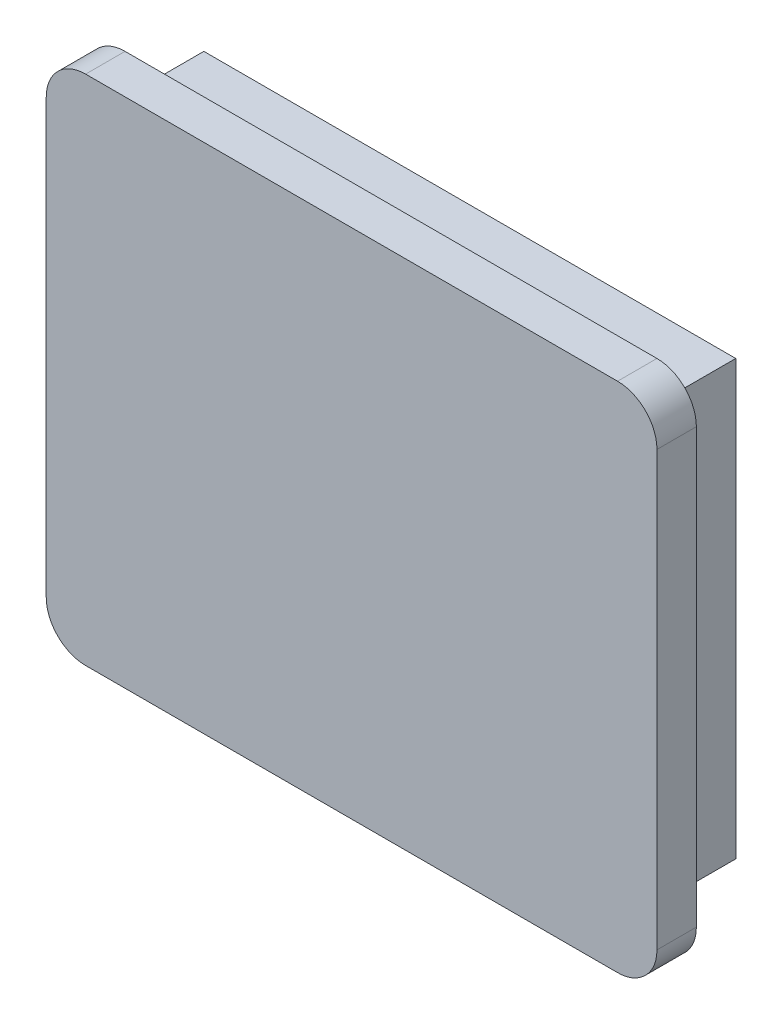
ISO-10303-21;
HEADER;
FILE_DESCRIPTION(('STEP AP214'),'2;1');
FILE_NAME('part.step','',(''),(''),'','','');
FILE_SCHEMA(('AUTOMOTIVE_DESIGN { 1 0 10303 214 1 1 1 1 }'));
ENDSEC;
DATA;
#1=APPLICATION_CONTEXT('core data for automotive mechanical design processes');
#2=APPLICATION_PROTOCOL_DEFINITION('international standard','automotive_design',2000,#1);
#3=PRODUCT_CONTEXT('',#1,'mechanical');
#4=PRODUCT('Part','Part','',(#3));
#5=PRODUCT_RELATED_PRODUCT_CATEGORY('part','',(#4));
#6=PRODUCT_DEFINITION_FORMATION('','',#4);
#7=PRODUCT_DEFINITION_CONTEXT('part definition',#1,'design');
#8=PRODUCT_DEFINITION('design','',#6,#7);
#9=PRODUCT_DEFINITION_SHAPE('','',#8);
#10=(LENGTH_UNIT() NAMED_UNIT(*) SI_UNIT(.MILLI.,.METRE.));
#11=(NAMED_UNIT(*) PLANE_ANGLE_UNIT() SI_UNIT($,.RADIAN.));
#12=(NAMED_UNIT(*) SI_UNIT($,.STERADIAN.) SOLID_ANGLE_UNIT());
#13=UNCERTAINTY_MEASURE_WITH_UNIT(LENGTH_MEASURE(1.E-05),#10,'distance_accuracy_value','');
#14=(GEOMETRIC_REPRESENTATION_CONTEXT(3) GLOBAL_UNCERTAINTY_ASSIGNED_CONTEXT((#13)) GLOBAL_UNIT_ASSIGNED_CONTEXT((#10,
#11,#12)) REPRESENTATION_CONTEXT('',''));
#15=CARTESIAN_POINT('',(0.,0.,0.));
#16=DIRECTION('',(0.,0.,1.));
#17=DIRECTION('',(1.,0.,0.));
#18=AXIS2_PLACEMENT_3D('',#15,#16,#17);
#19=CARTESIAN_POINT('',(0.,0.,0.));
#20=DIRECTION('',(0.,0.,1.));
#21=DIRECTION('',(1.,0.,0.));
#22=AXIS2_PLACEMENT_3D('',#19,#20,#21);
#23=PLANE('',#22);
#24=DIRECTION('',(0.,1.,0.));
#25=VECTOR('',#24,1.);
#26=CARTESIAN_POINT('',(7.75,-6.5,0.));
#27=LINE('',#26,#25);
#28=CARTESIAN_POINT('',(7.75,-5.5,0.));
#29=VERTEX_POINT('',#28);
#30=CARTESIAN_POINT('',(7.75,5.5,0.));
#31=VERTEX_POINT('',#30);
#32=EDGE_CURVE('E194',#29,#31,#27,.T.);
#33=ORIENTED_EDGE('',*,*,#32,.F.);
#34=CARTESIAN_POINT('',(6.75,-5.5,0.));
#35=DIRECTION('',(0.,0.,1.));
#36=DIRECTION('',(1.,0.,0.));
#37=AXIS2_PLACEMENT_3D('',#34,#35,#36);
#38=CIRCLE('',#37,1.);
#39=CARTESIAN_POINT('',(6.75,-6.5,0.));
#40=VERTEX_POINT('',#39);
#41=EDGE_CURVE('E208',#29,#40,#38,.F.);
#42=ORIENTED_EDGE('',*,*,#41,.T.);
#43=DIRECTION('',(1.,0.,0.));
#44=VECTOR('',#43,1.);
#45=CARTESIAN_POINT('',(7.75,-6.5,0.));
#46=LINE('',#45,#44);
#47=CARTESIAN_POINT('',(-6.75,-6.5,0.));
#48=VERTEX_POINT('',#47);
#49=EDGE_CURVE('E174',#48,#40,#46,.T.);
#50=ORIENTED_EDGE('',*,*,#49,.F.);
#51=CARTESIAN_POINT('',(-6.75,-5.5,0.));
#52=DIRECTION('',(0.,0.,1.));
#53=DIRECTION('',(1.,0.,0.));
#54=AXIS2_PLACEMENT_3D('',#51,#52,#53);
#55=CIRCLE('',#54,1.);
#56=CARTESIAN_POINT('',(-7.75,-5.5,0.));
#57=VERTEX_POINT('',#56);
#58=EDGE_CURVE('E206',#48,#57,#55,.F.);
#59=ORIENTED_EDGE('',*,*,#58,.T.);
#60=DIRECTION('',(0.,-1.,0.));
#61=VECTOR('',#60,1.);
#62=CARTESIAN_POINT('',(-7.75,-6.5,0.));
#63=LINE('',#62,#61);
#64=CARTESIAN_POINT('',(-7.75,5.5,0.));
#65=VERTEX_POINT('',#64);
#66=EDGE_CURVE('E171',#65,#57,#63,.T.);
#67=ORIENTED_EDGE('',*,*,#66,.F.);
#68=CARTESIAN_POINT('',(-6.75,5.5,0.));
#69=DIRECTION('',(0.,0.,1.));
#70=DIRECTION('',(1.,0.,0.));
#71=AXIS2_PLACEMENT_3D('',#68,#69,#70);
#72=CIRCLE('',#71,1.);
#73=CARTESIAN_POINT('',(-6.75,6.5,0.));
#74=VERTEX_POINT('',#73);
#75=EDGE_CURVE('E204',#65,#74,#72,.F.);
#76=ORIENTED_EDGE('',*,*,#75,.T.);
#77=DIRECTION('',(-1.,0.,0.));
#78=VECTOR('',#77,1.);
#79=CARTESIAN_POINT('',(7.75,6.5,0.));
#80=LINE('',#79,#78);
#81=CARTESIAN_POINT('',(6.75,6.5,0.));
#82=VERTEX_POINT('',#81);
#83=EDGE_CURVE('E184',#82,#74,#80,.T.);
#84=ORIENTED_EDGE('',*,*,#83,.F.);
#85=CARTESIAN_POINT('',(6.75,5.5,0.));
#86=DIRECTION('',(0.,0.,1.));
#87=DIRECTION('',(1.,0.,0.));
#88=AXIS2_PLACEMENT_3D('',#85,#86,#87);
#89=CIRCLE('',#88,1.);
#90=EDGE_CURVE('E202',#82,#31,#89,.F.);
#91=ORIENTED_EDGE('',*,*,#90,.T.);
#92=EDGE_LOOP('',(#33,#42,#50,#59,#67,#76,#84,#91));
#93=FACE_BOUND('',#92,.T.);
#94=DIRECTION('',(0.,-1.,0.));
#95=VECTOR('',#94,1.);
#96=CARTESIAN_POINT('',(6.75,-5.5,0.));
#97=LINE('',#96,#95);
#98=CARTESIAN_POINT('',(6.75,5.5,0.));
#99=VERTEX_POINT('',#98);
#100=CARTESIAN_POINT('',(6.75,-5.5,0.));
#101=VERTEX_POINT('',#100);
#102=EDGE_CURVE('E170',#99,#101,#97,.T.);
#103=ORIENTED_EDGE('',*,*,#102,.F.);
#104=DIRECTION('',(1.,0.,0.));
#105=VECTOR('',#104,1.);
#106=CARTESIAN_POINT('',(-6.75,5.5,0.));
#107=LINE('',#106,#105);
#108=CARTESIAN_POINT('',(-6.75,5.5,0.));
#109=VERTEX_POINT('',#108);
#110=EDGE_CURVE('E167',#109,#99,#107,.T.);
#111=ORIENTED_EDGE('',*,*,#110,.F.);
#112=DIRECTION('',(0.,1.,0.));
#113=VECTOR('',#112,1.);
#114=CARTESIAN_POINT('',(-6.75,4.5,0.));
#115=LINE('',#114,#113);
#116=CARTESIAN_POINT('',(-6.75,4.5,0.));
#117=VERTEX_POINT('',#116);
#118=EDGE_CURVE('E416',#117,#109,#115,.T.);
#119=ORIENTED_EDGE('',*,*,#118,.F.);
#120=DIRECTION('',(-1.,0.,0.));
#121=VECTOR('',#120,1.);
#122=CARTESIAN_POINT('',(-5.52272727272727,4.5,0.));
#123=LINE('',#122,#121);
#124=CARTESIAN_POINT('',(5.52272727272727,4.5,0.));
#125=VERTEX_POINT('',#124);
#126=EDGE_CURVE('E450',#125,#117,#123,.T.);
#127=ORIENTED_EDGE('',*,*,#126,.F.);
#128=DIRECTION('',(0.,1.,0.));
#129=VECTOR('',#128,1.);
#130=CARTESIAN_POINT('',(5.52272727272727,-4.5,0.));
#131=LINE('',#130,#129);
#132=CARTESIAN_POINT('',(5.52272727272727,-4.5,0.));
#133=VERTEX_POINT('',#132);
#134=EDGE_CURVE('E443',#133,#125,#131,.T.);
#135=ORIENTED_EDGE('',*,*,#134,.F.);
#136=DIRECTION('',(1.,0.,0.));
#137=VECTOR('',#136,1.);
#138=CARTESIAN_POINT('',(-5.52272727272727,-4.5,0.));
#139=LINE('',#138,#137);
#140=CARTESIAN_POINT('',(-6.75,-4.5,0.));
#141=VERTEX_POINT('',#140);
#142=EDGE_CURVE('E437',#141,#133,#139,.T.);
#143=ORIENTED_EDGE('',*,*,#142,.F.);
#144=DIRECTION('',(0.,1.,0.));
#145=VECTOR('',#144,1.);
#146=CARTESIAN_POINT('',(-6.75,-5.5,0.));
#147=LINE('',#146,#145);
#148=CARTESIAN_POINT('',(-6.75,-5.5,0.));
#149=VERTEX_POINT('',#148);
#150=EDGE_CURVE('E440',#149,#141,#147,.T.);
#151=ORIENTED_EDGE('',*,*,#150,.F.);
#152=DIRECTION('',(-1.,0.,0.));
#153=VECTOR('',#152,1.);
#154=CARTESIAN_POINT('',(-6.75,-5.5,0.));
#155=LINE('',#154,#153);
#156=EDGE_CURVE('E441',#101,#149,#155,.T.);
#157=ORIENTED_EDGE('',*,*,#156,.F.);
#158=EDGE_LOOP('',(#103,#111,#119,#127,#135,#143,#151,#157));
#159=FACE_BOUND('',#158,.T.);
#160=ADVANCED_FACE('F33',(#93,#159),#23,.F.);
#161=CARTESIAN_POINT('',(-7.75,-6.5,1.));
#162=DIRECTION('',(1.,0.,0.));
#163=DIRECTION('',(0.,0.,-1.));
#164=AXIS2_PLACEMENT_3D('',#161,#162,#163);
#165=PLANE('',#164);
#166=ORIENTED_EDGE('',*,*,#66,.T.);
#167=DIRECTION('',(0.,0.,-1.));
#168=VECTOR('',#167,1.);
#169=CARTESIAN_POINT('',(-7.75,-5.5,1.));
#170=LINE('',#169,#168);
#171=CARTESIAN_POINT('',(-7.75,-5.5,1.));
#172=VERTEX_POINT('',#171);
#173=EDGE_CURVE('E225',#57,#172,#170,.F.);
#174=ORIENTED_EDGE('',*,*,#173,.T.);
#175=DIRECTION('',(0.,-1.,0.));
#176=VECTOR('',#175,1.);
#177=CARTESIAN_POINT('',(-7.75,-6.5,1.));
#178=LINE('',#177,#176);
#179=CARTESIAN_POINT('',(-7.75,5.5,1.));
#180=VERTEX_POINT('',#179);
#181=EDGE_CURVE('E180',#180,#172,#178,.T.);
#182=ORIENTED_EDGE('',*,*,#181,.F.);
#183=DIRECTION('',(0.,0.,-1.));
#184=VECTOR('',#183,1.);
#185=CARTESIAN_POINT('',(-7.75,5.5,1.));
#186=LINE('',#185,#184);
#187=EDGE_CURVE('E222',#180,#65,#186,.T.);
#188=ORIENTED_EDGE('',*,*,#187,.T.);
#189=EDGE_LOOP('',(#166,#174,#182,#188));
#190=FACE_BOUND('',#189,.T.);
#191=ADVANCED_FACE('F241',(#190),#165,.F.);
#192=CARTESIAN_POINT('',(7.75,-6.5,1.));
#193=DIRECTION('',(0.,1.,0.));
#194=DIRECTION('',(0.,0.,1.));
#195=AXIS2_PLACEMENT_3D('',#192,#193,#194);
#196=PLANE('',#195);
#197=ORIENTED_EDGE('',*,*,#49,.T.);
#198=DIRECTION('',(0.,0.,-1.));
#199=VECTOR('',#198,1.);
#200=CARTESIAN_POINT('',(6.75,-6.5,1.));
#201=LINE('',#200,#199);
#202=CARTESIAN_POINT('',(6.75,-6.5,1.));
#203=VERTEX_POINT('',#202);
#204=EDGE_CURVE('E213',#40,#203,#201,.F.);
#205=ORIENTED_EDGE('',*,*,#204,.T.);
#206=DIRECTION('',(1.,0.,0.));
#207=VECTOR('',#206,1.);
#208=CARTESIAN_POINT('',(7.75,-6.5,1.));
#209=LINE('',#208,#207);
#210=CARTESIAN_POINT('',(-6.75,-6.5,1.));
#211=VERTEX_POINT('',#210);
#212=EDGE_CURVE('E183',#211,#203,#209,.T.);
#213=ORIENTED_EDGE('',*,*,#212,.F.);
#214=DIRECTION('',(0.,0.,-1.));
#215=VECTOR('',#214,1.);
#216=CARTESIAN_POINT('',(-6.75,-6.5,1.));
#217=LINE('',#216,#215);
#218=EDGE_CURVE('E210',#211,#48,#217,.T.);
#219=ORIENTED_EDGE('',*,*,#218,.T.);
#220=EDGE_LOOP('',(#197,#205,#213,#219));
#221=FACE_BOUND('',#220,.T.);
#222=ADVANCED_FACE('F251',(#221),#196,.F.);
#223=CARTESIAN_POINT('',(7.75,-6.5,1.));
#224=DIRECTION('',(-1.,0.,0.));
#225=DIRECTION('',(0.,0.,1.));
#226=AXIS2_PLACEMENT_3D('',#223,#224,#225);
#227=PLANE('',#226);
#228=DIRECTION('',(0.,1.,0.));
#229=VECTOR('',#228,1.);
#230=CARTESIAN_POINT('',(7.75,-6.5,1.));
#231=LINE('',#230,#229);
#232=CARTESIAN_POINT('',(7.75,-5.5,1.));
#233=VERTEX_POINT('',#232);
#234=CARTESIAN_POINT('',(7.75,5.5,1.));
#235=VERTEX_POINT('',#234);
#236=EDGE_CURVE('E187',#233,#235,#231,.T.);
#237=ORIENTED_EDGE('',*,*,#236,.F.);
#238=DIRECTION('',(0.,0.,-1.));
#239=VECTOR('',#238,1.);
#240=CARTESIAN_POINT('',(7.75,-5.5,1.));
#241=LINE('',#240,#239);
#242=EDGE_CURVE('E199',#233,#29,#241,.T.);
#243=ORIENTED_EDGE('',*,*,#242,.T.);
#244=ORIENTED_EDGE('',*,*,#32,.T.);
#245=DIRECTION('',(0.,0.,-1.));
#246=VECTOR('',#245,1.);
#247=CARTESIAN_POINT('',(7.75,5.5,1.));
#248=LINE('',#247,#246);
#249=EDGE_CURVE('E190',#31,#235,#248,.F.);
#250=ORIENTED_EDGE('',*,*,#249,.T.);
#251=EDGE_LOOP('',(#237,#243,#244,#250));
#252=FACE_BOUND('',#251,.T.);
#253=ADVANCED_FACE('F259',(#252),#227,.F.);
#254=CARTESIAN_POINT('',(7.75,6.5,1.));
#255=DIRECTION('',(0.,-1.,0.));
#256=DIRECTION('',(0.,0.,-1.));
#257=AXIS2_PLACEMENT_3D('',#254,#255,#256);
#258=PLANE('',#257);
#259=ORIENTED_EDGE('',*,*,#83,.T.);
#260=DIRECTION('',(0.,0.,-1.));
#261=VECTOR('',#260,1.);
#262=CARTESIAN_POINT('',(-6.75,6.5,1.));
#263=LINE('',#262,#261);
#264=CARTESIAN_POINT('',(-6.75,6.5,1.));
#265=VERTEX_POINT('',#264);
#266=EDGE_CURVE('E11',#74,#265,#263,.F.);
#267=ORIENTED_EDGE('',*,*,#266,.T.);
#268=DIRECTION('',(-1.,0.,0.));
#269=VECTOR('',#268,1.);
#270=CARTESIAN_POINT('',(7.75,6.5,1.));
#271=LINE('',#270,#269);
#272=CARTESIAN_POINT('',(6.75,6.5,1.));
#273=VERTEX_POINT('',#272);
#274=EDGE_CURVE('E189',#273,#265,#271,.T.);
#275=ORIENTED_EDGE('',*,*,#274,.F.);
#276=DIRECTION('',(0.,0.,-1.));
#277=VECTOR('',#276,1.);
#278=CARTESIAN_POINT('',(6.75,6.5,1.));
#279=LINE('',#278,#277);
#280=EDGE_CURVE('E41',#273,#82,#279,.T.);
#281=ORIENTED_EDGE('',*,*,#280,.T.);
#282=EDGE_LOOP('',(#259,#267,#275,#281));
#283=FACE_BOUND('',#282,.T.);
#284=ADVANCED_FACE('F229',(#283),#258,.F.);
#285=CARTESIAN_POINT('',(0.,0.,1.));
#286=DIRECTION('',(0.,0.,1.));
#287=DIRECTION('',(1.,0.,0.));
#288=AXIS2_PLACEMENT_3D('',#285,#286,#287);
#289=PLANE('',#288);
#290=ORIENTED_EDGE('',*,*,#212,.T.);
#291=CARTESIAN_POINT('',(6.75,-5.5,1.));
#292=DIRECTION('',(0.,0.,1.));
#293=DIRECTION('',(1.,0.,0.));
#294=AXIS2_PLACEMENT_3D('',#291,#292,#293);
#295=CIRCLE('',#294,1.);
#296=EDGE_CURVE('E220',#203,#233,#295,.T.);
#297=ORIENTED_EDGE('',*,*,#296,.T.);
#298=ORIENTED_EDGE('',*,*,#236,.T.);
#299=CARTESIAN_POINT('',(6.75,5.5,1.));
#300=DIRECTION('',(0.,0.,1.));
#301=DIRECTION('',(1.,0.,0.));
#302=AXIS2_PLACEMENT_3D('',#299,#300,#301);
#303=CIRCLE('',#302,1.);
#304=EDGE_CURVE('E53',#235,#273,#303,.T.);
#305=ORIENTED_EDGE('',*,*,#304,.T.);
#306=ORIENTED_EDGE('',*,*,#274,.T.);
#307=CARTESIAN_POINT('',(-6.75,5.5,1.));
#308=DIRECTION('',(0.,0.,1.));
#309=DIRECTION('',(1.,0.,0.));
#310=AXIS2_PLACEMENT_3D('',#307,#308,#309);
#311=CIRCLE('',#310,1.);
#312=EDGE_CURVE('E216',#265,#180,#311,.T.);
#313=ORIENTED_EDGE('',*,*,#312,.T.);
#314=ORIENTED_EDGE('',*,*,#181,.T.);
#315=CARTESIAN_POINT('',(-6.75,-5.5,1.));
#316=DIRECTION('',(0.,0.,1.));
#317=DIRECTION('',(1.,0.,0.));
#318=AXIS2_PLACEMENT_3D('',#315,#316,#317);
#319=CIRCLE('',#318,1.);
#320=EDGE_CURVE('E218',#172,#211,#319,.T.);
#321=ORIENTED_EDGE('',*,*,#320,.T.);
#322=EDGE_LOOP('',(#290,#297,#298,#305,#306,#313,#314,#321));
#323=FACE_BOUND('',#322,.T.);
#324=ADVANCED_FACE('F244',(#323),#289,.T.);
#325=CARTESIAN_POINT('',(6.75,-5.5,-2.));
#326=DIRECTION('',(-1.,0.,0.));
#327=DIRECTION('',(0.,0.,1.));
#328=AXIS2_PLACEMENT_3D('',#325,#326,#327);
#329=PLANE('',#328);
#330=ORIENTED_EDGE('',*,*,#102,.T.);
#331=DIRECTION('',(0.,0.,1.));
#332=VECTOR('',#331,1.);
#333=CARTESIAN_POINT('',(6.75,-5.5,-2.));
#334=LINE('',#333,#332);
#335=CARTESIAN_POINT('',(6.75,-5.5,-2.));
#336=VERTEX_POINT('',#335);
#337=EDGE_CURVE('E151',#336,#101,#334,.T.);
#338=ORIENTED_EDGE('',*,*,#337,.F.);
#339=DIRECTION('',(0.,-1.,0.));
#340=VECTOR('',#339,1.);
#341=CARTESIAN_POINT('',(6.75,-5.5,-2.));
#342=LINE('',#341,#340);
#343=CARTESIAN_POINT('',(6.75,5.5,-2.));
#344=VERTEX_POINT('',#343);
#345=EDGE_CURVE('E158',#344,#336,#342,.T.);
#346=ORIENTED_EDGE('',*,*,#345,.F.);
#347=DIRECTION('',(0.,0.,1.));
#348=VECTOR('',#347,1.);
#349=CARTESIAN_POINT('',(6.75,5.5,-2.));
#350=LINE('',#349,#348);
#351=EDGE_CURVE('E412',#344,#99,#350,.T.);
#352=ORIENTED_EDGE('',*,*,#351,.T.);
#353=EDGE_LOOP('',(#330,#338,#346,#352));
#354=FACE_BOUND('',#353,.T.);
#355=ADVANCED_FACE('F169',(#354),#329,.F.);
#356=CARTESIAN_POINT('',(-6.75,-5.5,-2.));
#357=DIRECTION('',(0.,1.,0.));
#358=DIRECTION('',(0.,0.,1.));
#359=AXIS2_PLACEMENT_3D('',#356,#357,#358);
#360=PLANE('',#359);
#361=ORIENTED_EDGE('',*,*,#156,.T.);
#362=DIRECTION('',(0.,0.,1.));
#363=VECTOR('',#362,1.);
#364=CARTESIAN_POINT('',(-6.75,-5.5,-2.));
#365=LINE('',#364,#363);
#366=CARTESIAN_POINT('',(-6.75,-5.5,-2.));
#367=VERTEX_POINT('',#366);
#368=EDGE_CURVE('E154',#367,#149,#365,.T.);
#369=ORIENTED_EDGE('',*,*,#368,.F.);
#370=DIRECTION('',(-1.,0.,0.));
#371=VECTOR('',#370,1.);
#372=CARTESIAN_POINT('',(-6.75,-5.5,-2.));
#373=LINE('',#372,#371);
#374=EDGE_CURVE('E146',#336,#367,#373,.T.);
#375=ORIENTED_EDGE('',*,*,#374,.F.);
#376=ORIENTED_EDGE('',*,*,#337,.T.);
#377=EDGE_LOOP('',(#361,#369,#375,#376));
#378=FACE_BOUND('',#377,.T.);
#379=ADVANCED_FACE('F149',(#378),#360,.F.);
#380=CARTESIAN_POINT('',(-6.75,-5.5,-2.));
#381=DIRECTION('',(1.,0.,0.));
#382=DIRECTION('',(0.,0.,-1.));
#383=AXIS2_PLACEMENT_3D('',#380,#381,#382);
#384=PLANE('',#383);
#385=ORIENTED_EDGE('',*,*,#150,.T.);
#386=DIRECTION('',(0.,0.,1.));
#387=VECTOR('',#386,1.);
#388=CARTESIAN_POINT('',(-6.75,-4.5,-2.));
#389=LINE('',#388,#387);
#390=CARTESIAN_POINT('',(-6.75,-4.5,-2.));
#391=VERTEX_POINT('',#390);
#392=EDGE_CURVE('E176',#391,#141,#389,.T.);
#393=ORIENTED_EDGE('',*,*,#392,.F.);
#394=DIRECTION('',(0.,1.,0.));
#395=VECTOR('',#394,1.);
#396=CARTESIAN_POINT('',(-6.75,-5.5,-2.));
#397=LINE('',#396,#395);
#398=EDGE_CURVE('E157',#367,#391,#397,.T.);
#399=ORIENTED_EDGE('',*,*,#398,.F.);
#400=ORIENTED_EDGE('',*,*,#368,.T.);
#401=EDGE_LOOP('',(#385,#393,#399,#400));
#402=FACE_BOUND('',#401,.T.);
#403=ADVANCED_FACE('F366',(#402),#384,.F.);
#404=CARTESIAN_POINT('',(-5.52272727272727,-4.5,-2.));
#405=DIRECTION('',(0.,-1.,0.));
#406=DIRECTION('',(0.,0.,-1.));
#407=AXIS2_PLACEMENT_3D('',#404,#405,#406);
#408=PLANE('',#407);
#409=ORIENTED_EDGE('',*,*,#142,.T.);
#410=DIRECTION('',(0.,0.,1.));
#411=VECTOR('',#410,1.);
#412=CARTESIAN_POINT('',(5.52272727272727,-4.5,-2.));
#413=LINE('',#412,#411);
#414=CARTESIAN_POINT('',(5.52272727272727,-4.5,-2.));
#415=VERTEX_POINT('',#414);
#416=EDGE_CURVE('E430',#415,#133,#413,.T.);
#417=ORIENTED_EDGE('',*,*,#416,.F.);
#418=DIRECTION('',(1.,0.,0.));
#419=VECTOR('',#418,1.);
#420=CARTESIAN_POINT('',(-5.52272727272727,-4.5,-2.));
#421=LINE('',#420,#419);
#422=EDGE_CURVE('E438',#391,#415,#421,.T.);
#423=ORIENTED_EDGE('',*,*,#422,.F.);
#424=ORIENTED_EDGE('',*,*,#392,.T.);
#425=EDGE_LOOP('',(#409,#417,#423,#424));
#426=FACE_BOUND('',#425,.T.);
#427=ADVANCED_FACE('F373',(#426),#408,.F.);
#428=CARTESIAN_POINT('',(5.52272727272727,-4.5,-2.));
#429=DIRECTION('',(1.,0.,0.));
#430=DIRECTION('',(0.,0.,-1.));
#431=AXIS2_PLACEMENT_3D('',#428,#429,#430);
#432=PLANE('',#431);
#433=ORIENTED_EDGE('',*,*,#134,.T.);
#434=DIRECTION('',(0.,0.,1.));
#435=VECTOR('',#434,1.);
#436=CARTESIAN_POINT('',(5.52272727272727,4.5,-2.));
#437=LINE('',#436,#435);
#438=CARTESIAN_POINT('',(5.52272727272727,4.5,-2.));
#439=VERTEX_POINT('',#438);
#440=EDGE_CURVE('E427',#439,#125,#437,.T.);
#441=ORIENTED_EDGE('',*,*,#440,.F.);
#442=DIRECTION('',(0.,1.,0.));
#443=VECTOR('',#442,1.);
#444=CARTESIAN_POINT('',(5.52272727272727,-4.5,-2.));
#445=LINE('',#444,#443);
#446=EDGE_CURVE('E458',#415,#439,#445,.T.);
#447=ORIENTED_EDGE('',*,*,#446,.F.);
#448=ORIENTED_EDGE('',*,*,#416,.T.);
#449=EDGE_LOOP('',(#433,#441,#447,#448));
#450=FACE_BOUND('',#449,.T.);
#451=ADVANCED_FACE('F381',(#450),#432,.F.);
#452=CARTESIAN_POINT('',(-5.52272727272727,4.5,-2.));
#453=DIRECTION('',(0.,1.,0.));
#454=DIRECTION('',(0.,0.,1.));
#455=AXIS2_PLACEMENT_3D('',#452,#453,#454);
#456=PLANE('',#455);
#457=ORIENTED_EDGE('',*,*,#126,.T.);
#458=DIRECTION('',(0.,0.,1.));
#459=VECTOR('',#458,1.);
#460=CARTESIAN_POINT('',(-6.75,4.5,-2.));
#461=LINE('',#460,#459);
#462=CARTESIAN_POINT('',(-6.75,4.5,-2.));
#463=VERTEX_POINT('',#462);
#464=EDGE_CURVE('E419',#463,#117,#461,.T.);
#465=ORIENTED_EDGE('',*,*,#464,.F.);
#466=DIRECTION('',(-1.,0.,0.));
#467=VECTOR('',#466,1.);
#468=CARTESIAN_POINT('',(-5.52272727272727,4.5,-2.));
#469=LINE('',#468,#467);
#470=EDGE_CURVE('E456',#439,#463,#469,.T.);
#471=ORIENTED_EDGE('',*,*,#470,.F.);
#472=ORIENTED_EDGE('',*,*,#440,.T.);
#473=EDGE_LOOP('',(#457,#465,#471,#472));
#474=FACE_BOUND('',#473,.T.);
#475=ADVANCED_FACE('F389',(#474),#456,.F.);
#476=CARTESIAN_POINT('',(-6.75,4.5,-2.));
#477=DIRECTION('',(1.,0.,0.));
#478=DIRECTION('',(0.,0.,-1.));
#479=AXIS2_PLACEMENT_3D('',#476,#477,#478);
#480=PLANE('',#479);
#481=ORIENTED_EDGE('',*,*,#118,.T.);
#482=DIRECTION('',(0.,0.,1.));
#483=VECTOR('',#482,1.);
#484=CARTESIAN_POINT('',(-6.75,5.5,-2.));
#485=LINE('',#484,#483);
#486=CARTESIAN_POINT('',(-6.75,5.5,-2.));
#487=VERTEX_POINT('',#486);
#488=EDGE_CURVE('E414',#487,#109,#485,.T.);
#489=ORIENTED_EDGE('',*,*,#488,.F.);
#490=DIRECTION('',(0.,1.,0.));
#491=VECTOR('',#490,1.);
#492=CARTESIAN_POINT('',(-6.75,4.5,-2.));
#493=LINE('',#492,#491);
#494=EDGE_CURVE('E421',#463,#487,#493,.T.);
#495=ORIENTED_EDGE('',*,*,#494,.F.);
#496=ORIENTED_EDGE('',*,*,#464,.T.);
#497=EDGE_LOOP('',(#481,#489,#495,#496));
#498=FACE_BOUND('',#497,.T.);
#499=ADVANCED_FACE('F397',(#498),#480,.F.);
#500=CARTESIAN_POINT('',(-6.75,5.5,-2.));
#501=DIRECTION('',(0.,-1.,0.));
#502=DIRECTION('',(0.,0.,-1.));
#503=AXIS2_PLACEMENT_3D('',#500,#501,#502);
#504=PLANE('',#503);
#505=ORIENTED_EDGE('',*,*,#110,.T.);
#506=ORIENTED_EDGE('',*,*,#351,.F.);
#507=DIRECTION('',(1.,0.,0.));
#508=VECTOR('',#507,1.);
#509=CARTESIAN_POINT('',(-6.75,5.5,-2.));
#510=LINE('',#509,#508);
#511=EDGE_CURVE('E163',#487,#344,#510,.T.);
#512=ORIENTED_EDGE('',*,*,#511,.F.);
#513=ORIENTED_EDGE('',*,*,#488,.T.);
#514=EDGE_LOOP('',(#505,#506,#512,#513));
#515=FACE_BOUND('',#514,.T.);
#516=ADVANCED_FACE('F312',(#515),#504,.F.);
#517=CARTESIAN_POINT('',(0.,0.,-2.));
#518=DIRECTION('',(0.,0.,-1.));
#519=DIRECTION('',(-1.,0.,0.));
#520=AXIS2_PLACEMENT_3D('',#517,#518,#519);
#521=PLANE('',#520);
#522=ORIENTED_EDGE('',*,*,#345,.T.);
#523=ORIENTED_EDGE('',*,*,#374,.T.);
#524=ORIENTED_EDGE('',*,*,#398,.T.);
#525=ORIENTED_EDGE('',*,*,#422,.T.);
#526=ORIENTED_EDGE('',*,*,#446,.T.);
#527=ORIENTED_EDGE('',*,*,#470,.T.);
#528=ORIENTED_EDGE('',*,*,#494,.T.);
#529=ORIENTED_EDGE('',*,*,#511,.T.);
#530=EDGE_LOOP('',(#522,#523,#524,#525,#526,#527,#528,#529));
#531=FACE_BOUND('',#530,.T.);
#532=ADVANCED_FACE('F161',(#531),#521,.T.);
#533=CARTESIAN_POINT('',(6.75,-5.5,1.));
#534=DIRECTION('',(0.,0.,-1.));
#535=DIRECTION('',(-1.,0.,0.));
#536=AXIS2_PLACEMENT_3D('',#533,#534,#535);
#537=CYLINDRICAL_SURFACE('',#536,1.);
#538=ORIENTED_EDGE('',*,*,#296,.F.);
#539=ORIENTED_EDGE('',*,*,#204,.F.);
#540=ORIENTED_EDGE('',*,*,#41,.F.);
#541=ORIENTED_EDGE('',*,*,#242,.F.);
#542=EDGE_LOOP('',(#538,#539,#540,#541));
#543=FACE_BOUND('',#542,.T.);
#544=ADVANCED_FACE('F256',(#543),#537,.T.);
#545=CARTESIAN_POINT('',(-6.75,-5.5,1.));
#546=DIRECTION('',(0.,0.,-1.));
#547=DIRECTION('',(-1.,0.,0.));
#548=AXIS2_PLACEMENT_3D('',#545,#546,#547);
#549=CYLINDRICAL_SURFACE('',#548,1.);
#550=ORIENTED_EDGE('',*,*,#320,.F.);
#551=ORIENTED_EDGE('',*,*,#173,.F.);
#552=ORIENTED_EDGE('',*,*,#58,.F.);
#553=ORIENTED_EDGE('',*,*,#218,.F.);
#554=EDGE_LOOP('',(#550,#551,#552,#553));
#555=FACE_BOUND('',#554,.T.);
#556=ADVANCED_FACE('F248',(#555),#549,.T.);
#557=CARTESIAN_POINT('',(-6.75,5.5,1.));
#558=DIRECTION('',(0.,0.,-1.));
#559=DIRECTION('',(-1.,0.,0.));
#560=AXIS2_PLACEMENT_3D('',#557,#558,#559);
#561=CYLINDRICAL_SURFACE('',#560,1.);
#562=ORIENTED_EDGE('',*,*,#312,.F.);
#563=ORIENTED_EDGE('',*,*,#266,.F.);
#564=ORIENTED_EDGE('',*,*,#75,.F.);
#565=ORIENTED_EDGE('',*,*,#187,.F.);
#566=EDGE_LOOP('',(#562,#563,#564,#565));
#567=FACE_BOUND('',#566,.T.);
#568=ADVANCED_FACE('F238',(#567),#561,.T.);
#569=CARTESIAN_POINT('',(6.75,5.5,1.));
#570=DIRECTION('',(0.,0.,-1.));
#571=DIRECTION('',(-1.,0.,0.));
#572=AXIS2_PLACEMENT_3D('',#569,#570,#571);
#573=CYLINDRICAL_SURFACE('',#572,1.);
#574=ORIENTED_EDGE('',*,*,#304,.F.);
#575=ORIENTED_EDGE('',*,*,#249,.F.);
#576=ORIENTED_EDGE('',*,*,#90,.F.);
#577=ORIENTED_EDGE('',*,*,#280,.F.);
#578=EDGE_LOOP('',(#574,#575,#576,#577));
#579=FACE_BOUND('',#578,.T.);
#580=ADVANCED_FACE('F35',(#579),#573,.T.);
#581=CLOSED_SHELL('',(#160,#191,#222,#253,#284,#324,#355,#379,#403,#427,#451,#475,#499,#516,
#532,#544,#556,#568,#580));
#582=MANIFOLD_SOLID_BREP('B2',#581);
#583=ADVANCED_BREP_SHAPE_REPRESENTATION('',(#18,#582),#14);
#584=SHAPE_DEFINITION_REPRESENTATION(#9,#583);
ENDSEC;
END-ISO-10303-21;
